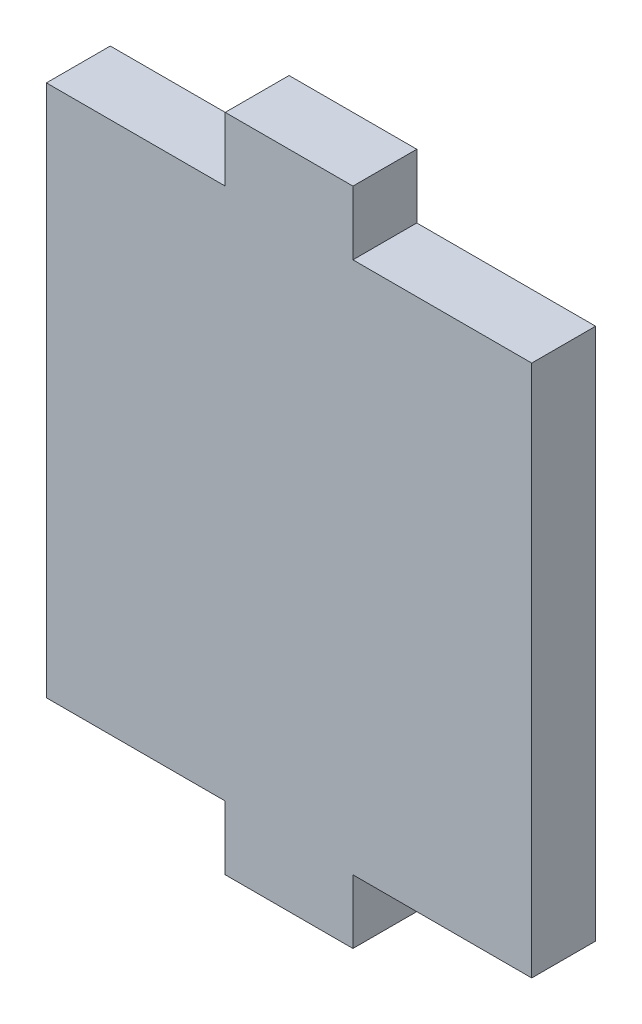
ISO-10303-21;
HEADER;
FILE_DESCRIPTION(('STEP AP214'),'2;1');
FILE_NAME('part.step','',(''),(''),'','','');
FILE_SCHEMA(('AUTOMOTIVE_DESIGN { 1 0 10303 214 1 1 1 1 }'));
ENDSEC;
DATA;
#1=APPLICATION_CONTEXT('core data for automotive mechanical design processes');
#2=APPLICATION_PROTOCOL_DEFINITION('international standard','automotive_design',2000,#1);
#3=PRODUCT_CONTEXT('',#1,'mechanical');
#4=PRODUCT('Part','Part','',(#3));
#5=PRODUCT_RELATED_PRODUCT_CATEGORY('part','',(#4));
#6=PRODUCT_DEFINITION_FORMATION('','',#4);
#7=PRODUCT_DEFINITION_CONTEXT('part definition',#1,'design');
#8=PRODUCT_DEFINITION('design','',#6,#7);
#9=PRODUCT_DEFINITION_SHAPE('','',#8);
#10=(LENGTH_UNIT() NAMED_UNIT(*) SI_UNIT(.MILLI.,.METRE.));
#11=(NAMED_UNIT(*) PLANE_ANGLE_UNIT() SI_UNIT($,.RADIAN.));
#12=(NAMED_UNIT(*) SI_UNIT($,.STERADIAN.) SOLID_ANGLE_UNIT());
#13=UNCERTAINTY_MEASURE_WITH_UNIT(LENGTH_MEASURE(1.E-05),#10,'distance_accuracy_value','');
#14=(GEOMETRIC_REPRESENTATION_CONTEXT(3) GLOBAL_UNCERTAINTY_ASSIGNED_CONTEXT((#13)) GLOBAL_UNIT_ASSIGNED_CONTEXT((#10,
#11,#12)) REPRESENTATION_CONTEXT('',''));
#15=CARTESIAN_POINT('',(0.,0.,0.));
#16=DIRECTION('',(0.,0.,1.));
#17=DIRECTION('',(1.,0.,0.));
#18=AXIS2_PLACEMENT_3D('',#15,#16,#17);
#19=CARTESIAN_POINT('',(-4.99999999999999,25.85,5.));
#20=DIRECTION('',(1.,0.,0.));
#21=DIRECTION('',(0.,1.,0.));
#22=AXIS2_PLACEMENT_3D('',#19,#20,#21);
#23=PLANE('',#22);
#24=DIRECTION('',(0.,-1.,0.));
#25=VECTOR('',#24,1.);
#26=CARTESIAN_POINT('',(-4.99999999999999,25.85,0.));
#27=LINE('',#26,#25);
#28=CARTESIAN_POINT('',(-4.99999999999999,25.85,0.));
#29=VERTEX_POINT('',#28);
#30=CARTESIAN_POINT('',(-4.99999999999999,20.85,0.));
#31=VERTEX_POINT('',#30);
#32=EDGE_CURVE('E159',#29,#31,#27,.T.);
#33=ORIENTED_EDGE('',*,*,#32,.T.);
#34=DIRECTION('',(0.,0.,-1.));
#35=VECTOR('',#34,1.);
#36=CARTESIAN_POINT('',(-4.99999999999999,20.85,5.));
#37=LINE('',#36,#35);
#38=CARTESIAN_POINT('',(-4.99999999999999,20.85,5.));
#39=VERTEX_POINT('',#38);
#40=EDGE_CURVE('E11',#39,#31,#37,.T.);
#41=ORIENTED_EDGE('',*,*,#40,.F.);
#42=DIRECTION('',(0.,-1.,0.));
#43=VECTOR('',#42,1.);
#44=CARTESIAN_POINT('',(-4.99999999999999,25.85,5.));
#45=LINE('',#44,#43);
#46=CARTESIAN_POINT('',(-4.99999999999999,25.85,5.));
#47=VERTEX_POINT('',#46);
#48=EDGE_CURVE('E181',#47,#39,#45,.T.);
#49=ORIENTED_EDGE('',*,*,#48,.F.);
#50=DIRECTION('',(0.,0.,-1.));
#51=VECTOR('',#50,1.);
#52=CARTESIAN_POINT('',(-4.99999999999999,25.85,5.));
#53=LINE('',#52,#51);
#54=EDGE_CURVE('E155',#47,#29,#53,.T.);
#55=ORIENTED_EDGE('',*,*,#54,.T.);
#56=EDGE_LOOP('',(#33,#41,#49,#55));
#57=FACE_BOUND('',#56,.T.);
#58=ADVANCED_FACE('F39',(#57),#23,.F.);
#59=CARTESIAN_POINT('',(-4.99999999999999,20.85,5.));
#60=DIRECTION('',(0.,-1.,0.));
#61=DIRECTION('',(0.,0.,-1.));
#62=AXIS2_PLACEMENT_3D('',#59,#60,#61);
#63=PLANE('',#62);
#64=DIRECTION('',(-1.,0.,0.));
#65=VECTOR('',#64,1.);
#66=CARTESIAN_POINT('',(-4.99999999999999,20.85,0.));
#67=LINE('',#66,#65);
#68=CARTESIAN_POINT('',(-19.,20.85,0.));
#69=VERTEX_POINT('',#68);
#70=EDGE_CURVE('E162',#31,#69,#67,.T.);
#71=ORIENTED_EDGE('',*,*,#70,.T.);
#72=DIRECTION('',(0.,0.,-1.));
#73=VECTOR('',#72,1.);
#74=CARTESIAN_POINT('',(-19.,20.85,5.));
#75=LINE('',#74,#73);
#76=CARTESIAN_POINT('',(-19.,20.85,5.));
#77=VERTEX_POINT('',#76);
#78=EDGE_CURVE('E47',#77,#69,#75,.T.);
#79=ORIENTED_EDGE('',*,*,#78,.F.);
#80=DIRECTION('',(-1.,0.,0.));
#81=VECTOR('',#80,1.);
#82=CARTESIAN_POINT('',(-4.99999999999999,20.85,5.));
#83=LINE('',#82,#81);
#84=EDGE_CURVE('E110',#39,#77,#83,.T.);
#85=ORIENTED_EDGE('',*,*,#84,.F.);
#86=ORIENTED_EDGE('',*,*,#40,.T.);
#87=EDGE_LOOP('',(#71,#79,#85,#86));
#88=FACE_BOUND('',#87,.T.);
#89=ADVANCED_FACE('F259',(#88),#63,.F.);
#90=CARTESIAN_POINT('',(-19.,20.85,5.));
#91=DIRECTION('',(1.,0.,0.));
#92=DIRECTION('',(0.,1.,0.));
#93=AXIS2_PLACEMENT_3D('',#90,#91,#92);
#94=PLANE('',#93);
#95=DIRECTION('',(0.,-1.,0.));
#96=VECTOR('',#95,1.);
#97=CARTESIAN_POINT('',(-19.,20.85,0.));
#98=LINE('',#97,#96);
#99=CARTESIAN_POINT('',(-19.,-20.85,0.));
#100=VERTEX_POINT('',#99);
#101=EDGE_CURVE('E164',#69,#100,#98,.T.);
#102=ORIENTED_EDGE('',*,*,#101,.T.);
#103=DIRECTION('',(0.,0.,-1.));
#104=VECTOR('',#103,1.);
#105=CARTESIAN_POINT('',(-19.,-20.85,5.));
#106=LINE('',#105,#104);
#107=CARTESIAN_POINT('',(-19.,-20.85,5.));
#108=VERTEX_POINT('',#107);
#109=EDGE_CURVE('E200',#108,#100,#106,.T.);
#110=ORIENTED_EDGE('',*,*,#109,.F.);
#111=DIRECTION('',(0.,-1.,0.));
#112=VECTOR('',#111,1.);
#113=CARTESIAN_POINT('',(-19.,20.85,5.));
#114=LINE('',#113,#112);
#115=EDGE_CURVE('E208',#77,#108,#114,.T.);
#116=ORIENTED_EDGE('',*,*,#115,.F.);
#117=ORIENTED_EDGE('',*,*,#78,.T.);
#118=EDGE_LOOP('',(#102,#110,#116,#117));
#119=FACE_BOUND('',#118,.T.);
#120=ADVANCED_FACE('F206',(#119),#94,.F.);
#121=CARTESIAN_POINT('',(-19.,-20.85,5.));
#122=DIRECTION('',(0.,1.,0.));
#123=DIRECTION('',(-1.,0.,0.));
#124=AXIS2_PLACEMENT_3D('',#121,#122,#123);
#125=PLANE('',#124);
#126=DIRECTION('',(1.,0.,0.));
#127=VECTOR('',#126,1.);
#128=CARTESIAN_POINT('',(-19.,-20.85,0.));
#129=LINE('',#128,#127);
#130=CARTESIAN_POINT('',(-4.99999999999999,-20.85,0.));
#131=VERTEX_POINT('',#130);
#132=EDGE_CURVE('E166',#100,#131,#129,.T.);
#133=ORIENTED_EDGE('',*,*,#132,.T.);
#134=DIRECTION('',(0.,0.,-1.));
#135=VECTOR('',#134,1.);
#136=CARTESIAN_POINT('',(-4.99999999999999,-20.85,5.));
#137=LINE('',#136,#135);
#138=CARTESIAN_POINT('',(-4.99999999999999,-20.85,5.));
#139=VERTEX_POINT('',#138);
#140=EDGE_CURVE('E197',#139,#131,#137,.T.);
#141=ORIENTED_EDGE('',*,*,#140,.F.);
#142=DIRECTION('',(1.,0.,0.));
#143=VECTOR('',#142,1.);
#144=CARTESIAN_POINT('',(-19.,-20.85,5.));
#145=LINE('',#144,#143);
#146=EDGE_CURVE('E226',#108,#139,#145,.T.);
#147=ORIENTED_EDGE('',*,*,#146,.F.);
#148=ORIENTED_EDGE('',*,*,#109,.T.);
#149=EDGE_LOOP('',(#133,#141,#147,#148));
#150=FACE_BOUND('',#149,.T.);
#151=ADVANCED_FACE('F217',(#150),#125,.F.);
#152=CARTESIAN_POINT('',(-4.99999999999999,-25.85,5.));
#153=DIRECTION('',(1.,0.,0.));
#154=DIRECTION('',(0.,1.,0.));
#155=AXIS2_PLACEMENT_3D('',#152,#153,#154);
#156=PLANE('',#155);
#157=DIRECTION('',(0.,-1.,0.));
#158=VECTOR('',#157,1.);
#159=CARTESIAN_POINT('',(-4.99999999999999,-25.85,0.));
#160=LINE('',#159,#158);
#161=CARTESIAN_POINT('',(-4.99999999999999,-25.85,0.));
#162=VERTEX_POINT('',#161);
#163=EDGE_CURVE('E168',#131,#162,#160,.T.);
#164=ORIENTED_EDGE('',*,*,#163,.T.);
#165=DIRECTION('',(0.,0.,-1.));
#166=VECTOR('',#165,1.);
#167=CARTESIAN_POINT('',(-4.99999999999999,-25.85,5.));
#168=LINE('',#167,#166);
#169=CARTESIAN_POINT('',(-4.99999999999999,-25.85,5.));
#170=VERTEX_POINT('',#169);
#171=EDGE_CURVE('E194',#170,#162,#168,.T.);
#172=ORIENTED_EDGE('',*,*,#171,.F.);
#173=DIRECTION('',(0.,-1.,0.));
#174=VECTOR('',#173,1.);
#175=CARTESIAN_POINT('',(-4.99999999999999,-25.85,5.));
#176=LINE('',#175,#174);
#177=EDGE_CURVE('E223',#139,#170,#176,.T.);
#178=ORIENTED_EDGE('',*,*,#177,.F.);
#179=ORIENTED_EDGE('',*,*,#140,.T.);
#180=EDGE_LOOP('',(#164,#172,#178,#179));
#181=FACE_BOUND('',#180,.T.);
#182=ADVANCED_FACE('F221',(#181),#156,.F.);
#183=CARTESIAN_POINT('',(5.00000000000001,-25.85,5.));
#184=DIRECTION('',(0.,1.,0.));
#185=DIRECTION('',(0.,0.,1.));
#186=AXIS2_PLACEMENT_3D('',#183,#184,#185);
#187=PLANE('',#186);
#188=DIRECTION('',(1.,0.,0.));
#189=VECTOR('',#188,1.);
#190=CARTESIAN_POINT('',(5.00000000000001,-25.85,0.));
#191=LINE('',#190,#189);
#192=CARTESIAN_POINT('',(5.00000000000001,-25.85,0.));
#193=VERTEX_POINT('',#192);
#194=EDGE_CURVE('E170',#162,#193,#191,.T.);
#195=ORIENTED_EDGE('',*,*,#194,.T.);
#196=DIRECTION('',(0.,0.,-1.));
#197=VECTOR('',#196,1.);
#198=CARTESIAN_POINT('',(5.00000000000001,-25.85,5.));
#199=LINE('',#198,#197);
#200=CARTESIAN_POINT('',(5.00000000000001,-25.85,5.));
#201=VERTEX_POINT('',#200);
#202=EDGE_CURVE('E191',#201,#193,#199,.T.);
#203=ORIENTED_EDGE('',*,*,#202,.F.);
#204=DIRECTION('',(1.,0.,0.));
#205=VECTOR('',#204,1.);
#206=CARTESIAN_POINT('',(5.00000000000001,-25.85,5.));
#207=LINE('',#206,#205);
#208=EDGE_CURVE('E225',#170,#201,#207,.T.);
#209=ORIENTED_EDGE('',*,*,#208,.F.);
#210=ORIENTED_EDGE('',*,*,#171,.T.);
#211=EDGE_LOOP('',(#195,#203,#209,#210));
#212=FACE_BOUND('',#211,.T.);
#213=ADVANCED_FACE('F272',(#212),#187,.F.);
#214=CARTESIAN_POINT('',(5.00000000000001,-20.85,5.));
#215=DIRECTION('',(-1.,0.,0.));
#216=DIRECTION('',(0.,-1.,0.));
#217=AXIS2_PLACEMENT_3D('',#214,#215,#216);
#218=PLANE('',#217);
#219=DIRECTION('',(0.,1.,0.));
#220=VECTOR('',#219,1.);
#221=CARTESIAN_POINT('',(5.00000000000001,-20.85,0.));
#222=LINE('',#221,#220);
#223=CARTESIAN_POINT('',(5.00000000000001,-20.85,0.));
#224=VERTEX_POINT('',#223);
#225=EDGE_CURVE('E172',#193,#224,#222,.T.);
#226=ORIENTED_EDGE('',*,*,#225,.T.);
#227=DIRECTION('',(0.,0.,-1.));
#228=VECTOR('',#227,1.);
#229=CARTESIAN_POINT('',(5.00000000000001,-20.85,5.));
#230=LINE('',#229,#228);
#231=CARTESIAN_POINT('',(5.00000000000001,-20.85,5.));
#232=VERTEX_POINT('',#231);
#233=EDGE_CURVE('E188',#232,#224,#230,.T.);
#234=ORIENTED_EDGE('',*,*,#233,.F.);
#235=DIRECTION('',(0.,1.,0.));
#236=VECTOR('',#235,1.);
#237=CARTESIAN_POINT('',(5.00000000000001,-20.85,5.));
#238=LINE('',#237,#236);
#239=EDGE_CURVE('E228',#201,#232,#238,.T.);
#240=ORIENTED_EDGE('',*,*,#239,.F.);
#241=ORIENTED_EDGE('',*,*,#202,.T.);
#242=EDGE_LOOP('',(#226,#234,#240,#241));
#243=FACE_BOUND('',#242,.T.);
#244=ADVANCED_FACE('F275',(#243),#218,.F.);
#245=CARTESIAN_POINT('',(5.00000000000001,-20.85,5.));
#246=DIRECTION('',(0.,1.,0.));
#247=DIRECTION('',(-1.,0.,0.));
#248=AXIS2_PLACEMENT_3D('',#245,#246,#247);
#249=PLANE('',#248);
#250=DIRECTION('',(1.,0.,0.));
#251=VECTOR('',#250,1.);
#252=CARTESIAN_POINT('',(5.00000000000001,-20.85,0.));
#253=LINE('',#252,#251);
#254=CARTESIAN_POINT('',(19.,-20.85,0.));
#255=VERTEX_POINT('',#254);
#256=EDGE_CURVE('E174',#224,#255,#253,.T.);
#257=ORIENTED_EDGE('',*,*,#256,.T.);
#258=DIRECTION('',(0.,0.,-1.));
#259=VECTOR('',#258,1.);
#260=CARTESIAN_POINT('',(19.,-20.85,5.));
#261=LINE('',#260,#259);
#262=CARTESIAN_POINT('',(19.,-20.85,5.));
#263=VERTEX_POINT('',#262);
#264=EDGE_CURVE('E185',#263,#255,#261,.T.);
#265=ORIENTED_EDGE('',*,*,#264,.F.);
#266=DIRECTION('',(1.,0.,0.));
#267=VECTOR('',#266,1.);
#268=CARTESIAN_POINT('',(5.00000000000001,-20.85,5.));
#269=LINE('',#268,#267);
#270=EDGE_CURVE('E234',#232,#263,#269,.T.);
#271=ORIENTED_EDGE('',*,*,#270,.F.);
#272=ORIENTED_EDGE('',*,*,#233,.T.);
#273=EDGE_LOOP('',(#257,#265,#271,#272));
#274=FACE_BOUND('',#273,.T.);
#275=ADVANCED_FACE('F240',(#274),#249,.F.);
#276=CARTESIAN_POINT('',(19.,-20.85,5.));
#277=DIRECTION('',(-1.,0.,0.));
#278=DIRECTION('',(0.,-1.,0.));
#279=AXIS2_PLACEMENT_3D('',#276,#277,#278);
#280=PLANE('',#279);
#281=DIRECTION('',(0.,1.,0.));
#282=VECTOR('',#281,1.);
#283=CARTESIAN_POINT('',(19.,-20.85,0.));
#284=LINE('',#283,#282);
#285=CARTESIAN_POINT('',(19.,20.85,0.));
#286=VERTEX_POINT('',#285);
#287=EDGE_CURVE('E176',#255,#286,#284,.T.);
#288=ORIENTED_EDGE('',*,*,#287,.T.);
#289=DIRECTION('',(0.,0.,-1.));
#290=VECTOR('',#289,1.);
#291=CARTESIAN_POINT('',(19.,20.85,5.));
#292=LINE('',#291,#290);
#293=CARTESIAN_POINT('',(19.,20.85,5.));
#294=VERTEX_POINT('',#293);
#295=EDGE_CURVE('E150',#294,#286,#292,.T.);
#296=ORIENTED_EDGE('',*,*,#295,.F.);
#297=DIRECTION('',(0.,1.,0.));
#298=VECTOR('',#297,1.);
#299=CARTESIAN_POINT('',(19.,-20.85,5.));
#300=LINE('',#299,#298);
#301=EDGE_CURVE('E141',#263,#294,#300,.T.);
#302=ORIENTED_EDGE('',*,*,#301,.F.);
#303=ORIENTED_EDGE('',*,*,#264,.T.);
#304=EDGE_LOOP('',(#288,#296,#302,#303));
#305=FACE_BOUND('',#304,.T.);
#306=ADVANCED_FACE('F244',(#305),#280,.F.);
#307=CARTESIAN_POINT('',(19.,20.85,5.));
#308=DIRECTION('',(0.,-1.,0.));
#309=DIRECTION('',(0.,0.,-1.));
#310=AXIS2_PLACEMENT_3D('',#307,#308,#309);
#311=PLANE('',#310);
#312=DIRECTION('',(-1.,0.,0.));
#313=VECTOR('',#312,1.);
#314=CARTESIAN_POINT('',(19.,20.85,0.));
#315=LINE('',#314,#313);
#316=CARTESIAN_POINT('',(5.00000000000001,20.85,0.));
#317=VERTEX_POINT('',#316);
#318=EDGE_CURVE('E149',#286,#317,#315,.T.);
#319=ORIENTED_EDGE('',*,*,#318,.T.);
#320=DIRECTION('',(0.,0.,-1.));
#321=VECTOR('',#320,1.);
#322=CARTESIAN_POINT('',(5.00000000000001,20.85,5.));
#323=LINE('',#322,#321);
#324=CARTESIAN_POINT('',(5.00000000000001,20.85,5.));
#325=VERTEX_POINT('',#324);
#326=EDGE_CURVE('E146',#325,#317,#323,.T.);
#327=ORIENTED_EDGE('',*,*,#326,.F.);
#328=DIRECTION('',(-1.,0.,0.));
#329=VECTOR('',#328,1.);
#330=CARTESIAN_POINT('',(19.,20.85,5.));
#331=LINE('',#330,#329);
#332=EDGE_CURVE('E135',#294,#325,#331,.T.);
#333=ORIENTED_EDGE('',*,*,#332,.F.);
#334=ORIENTED_EDGE('',*,*,#295,.T.);
#335=EDGE_LOOP('',(#319,#327,#333,#334));
#336=FACE_BOUND('',#335,.T.);
#337=ADVANCED_FACE('F147',(#336),#311,.F.);
#338=CARTESIAN_POINT('',(5.00000000000001,20.85,5.));
#339=DIRECTION('',(-1.,0.,0.));
#340=DIRECTION('',(0.,-1.,0.));
#341=AXIS2_PLACEMENT_3D('',#338,#339,#340);
#342=PLANE('',#341);
#343=DIRECTION('',(0.,1.,0.));
#344=VECTOR('',#343,1.);
#345=CARTESIAN_POINT('',(5.00000000000001,20.85,0.));
#346=LINE('',#345,#344);
#347=CARTESIAN_POINT('',(5.00000000000001,25.85,0.));
#348=VERTEX_POINT('',#347);
#349=EDGE_CURVE('E96',#317,#348,#346,.T.);
#350=ORIENTED_EDGE('',*,*,#349,.T.);
#351=DIRECTION('',(0.,0.,-1.));
#352=VECTOR('',#351,1.);
#353=CARTESIAN_POINT('',(5.00000000000001,25.85,5.));
#354=LINE('',#353,#352);
#355=CARTESIAN_POINT('',(5.00000000000001,25.85,5.));
#356=VERTEX_POINT('',#355);
#357=EDGE_CURVE('E151',#356,#348,#354,.T.);
#358=ORIENTED_EDGE('',*,*,#357,.F.);
#359=DIRECTION('',(0.,1.,0.));
#360=VECTOR('',#359,1.);
#361=CARTESIAN_POINT('',(5.00000000000001,20.85,5.));
#362=LINE('',#361,#360);
#363=EDGE_CURVE('E139',#325,#356,#362,.T.);
#364=ORIENTED_EDGE('',*,*,#363,.F.);
#365=ORIENTED_EDGE('',*,*,#326,.T.);
#366=EDGE_LOOP('',(#350,#358,#364,#365));
#367=FACE_BOUND('',#366,.T.);
#368=ADVANCED_FACE('F153',(#367),#342,.F.);
#369=CARTESIAN_POINT('',(5.00000000000001,25.85,5.));
#370=DIRECTION('',(0.,-1.,0.));
#371=DIRECTION('',(0.,0.,-1.));
#372=AXIS2_PLACEMENT_3D('',#369,#370,#371);
#373=PLANE('',#372);
#374=DIRECTION('',(-1.,0.,0.));
#375=VECTOR('',#374,1.);
#376=CARTESIAN_POINT('',(5.00000000000001,25.85,0.));
#377=LINE('',#376,#375);
#378=EDGE_CURVE('E102',#348,#29,#377,.T.);
#379=ORIENTED_EDGE('',*,*,#378,.T.);
#380=ORIENTED_EDGE('',*,*,#54,.F.);
#381=DIRECTION('',(-1.,0.,0.));
#382=VECTOR('',#381,1.);
#383=CARTESIAN_POINT('',(5.00000000000001,25.85,5.));
#384=LINE('',#383,#382);
#385=EDGE_CURVE('E55',#356,#47,#384,.T.);
#386=ORIENTED_EDGE('',*,*,#385,.F.);
#387=ORIENTED_EDGE('',*,*,#357,.T.);
#388=EDGE_LOOP('',(#379,#380,#386,#387));
#389=FACE_BOUND('',#388,.T.);
#390=ADVANCED_FACE('F248',(#389),#373,.F.);
#391=CARTESIAN_POINT('',(0.,0.,5.));
#392=DIRECTION('',(0.,0.,-1.));
#393=DIRECTION('',(-1.,0.,0.));
#394=AXIS2_PLACEMENT_3D('',#391,#392,#393);
#395=PLANE('',#394);
#396=ORIENTED_EDGE('',*,*,#48,.T.);
#397=ORIENTED_EDGE('',*,*,#84,.T.);
#398=ORIENTED_EDGE('',*,*,#115,.T.);
#399=ORIENTED_EDGE('',*,*,#146,.T.);
#400=ORIENTED_EDGE('',*,*,#177,.T.);
#401=ORIENTED_EDGE('',*,*,#208,.T.);
#402=ORIENTED_EDGE('',*,*,#239,.T.);
#403=ORIENTED_EDGE('',*,*,#270,.T.);
#404=ORIENTED_EDGE('',*,*,#301,.T.);
#405=ORIENTED_EDGE('',*,*,#332,.T.);
#406=ORIENTED_EDGE('',*,*,#363,.T.);
#407=ORIENTED_EDGE('',*,*,#385,.T.);
#408=EDGE_LOOP('',(#396,#397,#398,#399,#400,#401,#402,#403,#404,#405,#406,#407));
#409=FACE_BOUND('',#408,.T.);
#410=ADVANCED_FACE('F137',(#409),#395,.F.);
#411=CARTESIAN_POINT('',(0.,0.,0.));
#412=DIRECTION('',(0.,0.,-1.));
#413=DIRECTION('',(-1.,0.,0.));
#414=AXIS2_PLACEMENT_3D('',#411,#412,#413);
#415=PLANE('',#414);
#416=ORIENTED_EDGE('',*,*,#32,.F.);
#417=ORIENTED_EDGE('',*,*,#378,.F.);
#418=ORIENTED_EDGE('',*,*,#349,.F.);
#419=ORIENTED_EDGE('',*,*,#318,.F.);
#420=ORIENTED_EDGE('',*,*,#287,.F.);
#421=ORIENTED_EDGE('',*,*,#256,.F.);
#422=ORIENTED_EDGE('',*,*,#225,.F.);
#423=ORIENTED_EDGE('',*,*,#194,.F.);
#424=ORIENTED_EDGE('',*,*,#163,.F.);
#425=ORIENTED_EDGE('',*,*,#132,.F.);
#426=ORIENTED_EDGE('',*,*,#101,.F.);
#427=ORIENTED_EDGE('',*,*,#70,.F.);
#428=EDGE_LOOP('',(#416,#417,#418,#419,#420,#421,#422,#423,#424,#425,#426,#427));
#429=FACE_BOUND('',#428,.T.);
#430=ADVANCED_FACE('F212',(#429),#415,.T.);
#431=CLOSED_SHELL('',(#58,#89,#120,#151,#182,#213,#244,#275,#306,#337,#368,#390,#410,#430));
#432=MANIFOLD_SOLID_BREP('B2',#431);
#433=ADVANCED_BREP_SHAPE_REPRESENTATION('',(#18,#432),#14);
#434=SHAPE_DEFINITION_REPRESENTATION(#9,#433);
ENDSEC;
END-ISO-10303-21;
